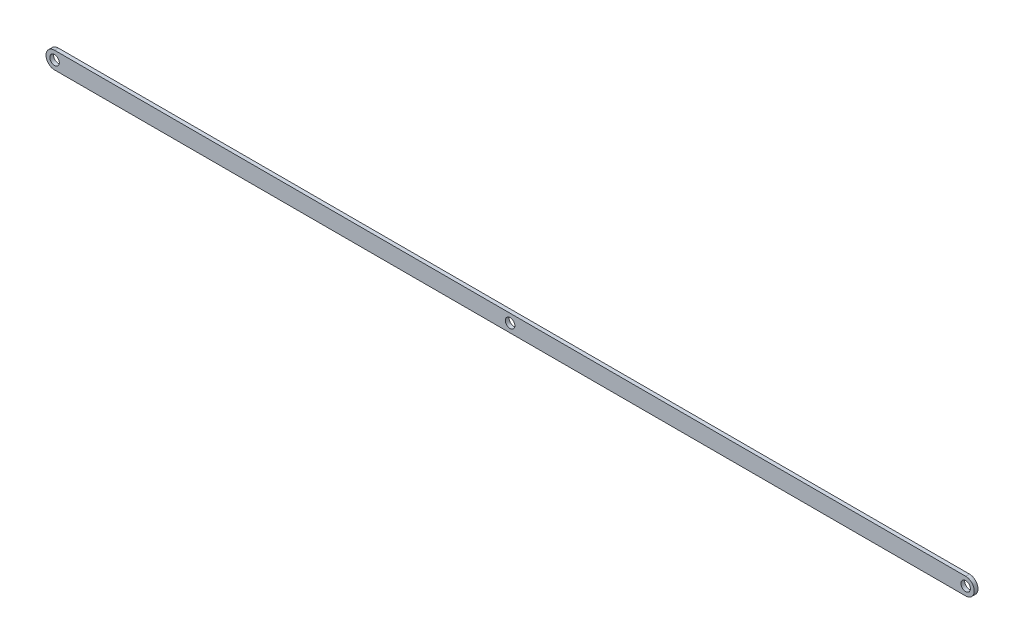
ISO-10303-21;
HEADER;
FILE_DESCRIPTION(('STEP AP214'),'2;1');
FILE_NAME('part.step','',(''),(''),'','','');
FILE_SCHEMA(('AUTOMOTIVE_DESIGN { 1 0 10303 214 1 1 1 1 }'));
ENDSEC;
DATA;
#1=APPLICATION_CONTEXT('core data for automotive mechanical design processes');
#2=APPLICATION_PROTOCOL_DEFINITION('international standard','automotive_design',2000,#1);
#3=PRODUCT_CONTEXT('',#1,'mechanical');
#4=PRODUCT('Part','Part','',(#3));
#5=PRODUCT_RELATED_PRODUCT_CATEGORY('part','',(#4));
#6=PRODUCT_DEFINITION_FORMATION('','',#4);
#7=PRODUCT_DEFINITION_CONTEXT('part definition',#1,'design');
#8=PRODUCT_DEFINITION('design','',#6,#7);
#9=PRODUCT_DEFINITION_SHAPE('','',#8);
#10=(LENGTH_UNIT() NAMED_UNIT(*) SI_UNIT(.MILLI.,.METRE.));
#11=(NAMED_UNIT(*) PLANE_ANGLE_UNIT() SI_UNIT($,.RADIAN.));
#12=(NAMED_UNIT(*) SI_UNIT($,.STERADIAN.) SOLID_ANGLE_UNIT());
#13=UNCERTAINTY_MEASURE_WITH_UNIT(LENGTH_MEASURE(1.E-05),#10,'distance_accuracy_value','');
#14=(GEOMETRIC_REPRESENTATION_CONTEXT(3) GLOBAL_UNCERTAINTY_ASSIGNED_CONTEXT((#13)) GLOBAL_UNIT_ASSIGNED_CONTEXT((#10,
#11,#12)) REPRESENTATION_CONTEXT('',''));
#15=CARTESIAN_POINT('',(0.,0.,0.));
#16=DIRECTION('',(0.,0.,1.));
#17=DIRECTION('',(1.,0.,0.));
#18=AXIS2_PLACEMENT_3D('',#15,#16,#17);
#19=CARTESIAN_POINT('',(-4500.,0.,37.5));
#20=DIRECTION('',(0.,0.,1.));
#21=DIRECTION('',(1.,0.,0.));
#22=AXIS2_PLACEMENT_3D('',#19,#20,#21);
#23=PLANE('',#22);
#24=CARTESIAN_POINT('',(0.,5.51091059616309E-13,37.5));
#25=DIRECTION('',(0.,0.,1.));
#26=DIRECTION('',(1.,0.,0.));
#27=AXIS2_PLACEMENT_3D('',#24,#25,#26);
#28=CIRCLE('',#27,46.875);
#29=CARTESIAN_POINT('',(46.875,5.51091059616309E-13,37.5));
#30=VERTEX_POINT('',#29);
#31=EDGE_CURVE('E117',#30,#30,#28,.T.);
#32=ORIENTED_EDGE('',*,*,#31,.F.);
#33=EDGE_LOOP('',(#32));
#34=FACE_BOUND('',#33,.T.);
#35=CARTESIAN_POINT('',(-4500.,0.,37.5));
#36=DIRECTION('',(0.,0.,1.));
#37=DIRECTION('',(1.,0.,0.));
#38=AXIS2_PLACEMENT_3D('',#35,#36,#37);
#39=CIRCLE('',#38,84.375);
#40=CARTESIAN_POINT('',(-4500.,84.375,37.5));
#41=VERTEX_POINT('',#40);
#42=CARTESIAN_POINT('',(-4500.,-84.375,37.5));
#43=VERTEX_POINT('',#42);
#44=EDGE_CURVE('E87',#41,#43,#39,.T.);
#45=ORIENTED_EDGE('',*,*,#44,.T.);
#46=DIRECTION('',(1.,0.,0.));
#47=VECTOR('',#46,1.);
#48=CARTESIAN_POINT('',(-4500.,-84.375,37.5));
#49=LINE('',#48,#47);
#50=CARTESIAN_POINT('',(4500.,-84.3749999999984,37.5));
#51=VERTEX_POINT('',#50);
#52=EDGE_CURVE('E82',#43,#51,#49,.T.);
#53=ORIENTED_EDGE('',*,*,#52,.T.);
#54=CARTESIAN_POINT('',(4500.,1.65327317884893E-12,37.5));
#55=DIRECTION('',(0.,0.,1.));
#56=DIRECTION('',(1.,0.,0.));
#57=AXIS2_PLACEMENT_3D('',#54,#55,#56);
#58=CIRCLE('',#57,84.375);
#59=CARTESIAN_POINT('',(4500.,84.3750000000017,37.5));
#60=VERTEX_POINT('',#59);
#61=EDGE_CURVE('E85',#51,#60,#58,.T.);
#62=ORIENTED_EDGE('',*,*,#61,.T.);
#63=DIRECTION('',(-1.,0.,0.));
#64=VECTOR('',#63,1.);
#65=CARTESIAN_POINT('',(-4500.,84.375,37.5));
#66=LINE('',#65,#64);
#67=EDGE_CURVE('E52',#60,#41,#66,.T.);
#68=ORIENTED_EDGE('',*,*,#67,.T.);
#69=EDGE_LOOP('',(#45,#53,#62,#68));
#70=FACE_BOUND('',#69,.T.);
#71=CARTESIAN_POINT('',(-4500.,0.,37.5));
#72=DIRECTION('',(0.,0.,1.));
#73=DIRECTION('',(1.,0.,0.));
#74=AXIS2_PLACEMENT_3D('',#71,#72,#73);
#75=CIRCLE('',#74,46.8750000000003);
#76=CARTESIAN_POINT('',(-4453.125,0.,37.5));
#77=VERTEX_POINT('',#76);
#78=EDGE_CURVE('E102',#77,#77,#75,.T.);
#79=ORIENTED_EDGE('',*,*,#78,.F.);
#80=EDGE_LOOP('',(#79));
#81=FACE_BOUND('',#80,.T.);
#82=CARTESIAN_POINT('',(4500.,1.65327317884893E-12,37.5));
#83=DIRECTION('',(0.,0.,1.));
#84=DIRECTION('',(1.,0.,0.));
#85=AXIS2_PLACEMENT_3D('',#82,#83,#84);
#86=CIRCLE('',#85,46.8750000000003);
#87=CARTESIAN_POINT('',(4546.875,1.65327317884893E-12,37.5));
#88=VERTEX_POINT('',#87);
#89=EDGE_CURVE('E123',#88,#88,#86,.T.);
#90=ORIENTED_EDGE('',*,*,#89,.F.);
#91=EDGE_LOOP('',(#90));
#92=FACE_BOUND('',#91,.T.);
#93=ADVANCED_FACE('F35',(#34,#70,#81,#92),#23,.T.);
#94=CARTESIAN_POINT('',(-4500.,0.,0.));
#95=DIRECTION('',(0.,0.,1.));
#96=DIRECTION('',(1.,0.,0.));
#97=AXIS2_PLACEMENT_3D('',#94,#95,#96);
#98=PLANE('',#97);
#99=CARTESIAN_POINT('',(0.,5.51091059616309E-13,0.));
#100=DIRECTION('',(0.,0.,1.));
#101=DIRECTION('',(1.,0.,0.));
#102=AXIS2_PLACEMENT_3D('',#99,#100,#101);
#103=CIRCLE('',#102,46.875);
#104=CARTESIAN_POINT('',(46.875,5.51091059616309E-13,0.));
#105=VERTEX_POINT('',#104);
#106=EDGE_CURVE('E120',#105,#105,#103,.T.);
#107=ORIENTED_EDGE('',*,*,#106,.T.);
#108=EDGE_LOOP('',(#107));
#109=FACE_BOUND('',#108,.T.);
#110=CARTESIAN_POINT('',(-4500.,0.,0.));
#111=DIRECTION('',(0.,0.,1.));
#112=DIRECTION('',(1.,0.,0.));
#113=AXIS2_PLACEMENT_3D('',#110,#111,#112);
#114=CIRCLE('',#113,84.375);
#115=CARTESIAN_POINT('',(-4500.,84.375,0.));
#116=VERTEX_POINT('',#115);
#117=CARTESIAN_POINT('',(-4500.,-84.375,0.));
#118=VERTEX_POINT('',#117);
#119=EDGE_CURVE('E99',#116,#118,#114,.T.);
#120=ORIENTED_EDGE('',*,*,#119,.F.);
#121=DIRECTION('',(-1.,0.,0.));
#122=VECTOR('',#121,1.);
#123=CARTESIAN_POINT('',(-4500.,84.375,0.));
#124=LINE('',#123,#122);
#125=CARTESIAN_POINT('',(4500.,84.3750000000017,0.));
#126=VERTEX_POINT('',#125);
#127=EDGE_CURVE('E75',#126,#116,#124,.T.);
#128=ORIENTED_EDGE('',*,*,#127,.F.);
#129=CARTESIAN_POINT('',(4500.,1.65327317884893E-12,0.));
#130=DIRECTION('',(0.,0.,1.));
#131=DIRECTION('',(1.,0.,0.));
#132=AXIS2_PLACEMENT_3D('',#129,#130,#131);
#133=CIRCLE('',#132,84.375);
#134=CARTESIAN_POINT('',(4500.,-84.3749999999984,0.));
#135=VERTEX_POINT('',#134);
#136=EDGE_CURVE('E69',#135,#126,#133,.T.);
#137=ORIENTED_EDGE('',*,*,#136,.F.);
#138=DIRECTION('',(1.,0.,0.));
#139=VECTOR('',#138,1.);
#140=CARTESIAN_POINT('',(-4500.,-84.375,0.));
#141=LINE('',#140,#139);
#142=EDGE_CURVE('E91',#118,#135,#141,.T.);
#143=ORIENTED_EDGE('',*,*,#142,.F.);
#144=EDGE_LOOP('',(#120,#128,#137,#143));
#145=FACE_BOUND('',#144,.T.);
#146=CARTESIAN_POINT('',(-4500.,0.,0.));
#147=DIRECTION('',(0.,0.,1.));
#148=DIRECTION('',(1.,0.,0.));
#149=AXIS2_PLACEMENT_3D('',#146,#147,#148);
#150=CIRCLE('',#149,46.8750000000003);
#151=CARTESIAN_POINT('',(-4453.125,0.,0.));
#152=VERTEX_POINT('',#151);
#153=EDGE_CURVE('E114',#152,#152,#150,.T.);
#154=ORIENTED_EDGE('',*,*,#153,.T.);
#155=EDGE_LOOP('',(#154));
#156=FACE_BOUND('',#155,.T.);
#157=CARTESIAN_POINT('',(4500.,1.65327317884893E-12,0.));
#158=DIRECTION('',(0.,0.,1.));
#159=DIRECTION('',(1.,0.,0.));
#160=AXIS2_PLACEMENT_3D('',#157,#158,#159);
#161=CIRCLE('',#160,46.8750000000003);
#162=CARTESIAN_POINT('',(4546.875,1.65327317884893E-12,0.));
#163=VERTEX_POINT('',#162);
#164=EDGE_CURVE('E126',#163,#163,#161,.T.);
#165=ORIENTED_EDGE('',*,*,#164,.T.);
#166=EDGE_LOOP('',(#165));
#167=FACE_BOUND('',#166,.T.);
#168=ADVANCED_FACE('F110',(#109,#145,#156,#167),#98,.F.);
#169=CARTESIAN_POINT('',(-4500.,0.,37.5));
#170=DIRECTION('',(0.,0.,-1.));
#171=DIRECTION('',(-1.,0.,0.));
#172=AXIS2_PLACEMENT_3D('',#169,#170,#171);
#173=CYLINDRICAL_SURFACE('',#172,84.375);
#174=ORIENTED_EDGE('',*,*,#119,.T.);
#175=DIRECTION('',(0.,0.,-1.));
#176=VECTOR('',#175,1.);
#177=CARTESIAN_POINT('',(-4500.,-84.375,37.5));
#178=LINE('',#177,#176);
#179=EDGE_CURVE('E11',#43,#118,#178,.T.);
#180=ORIENTED_EDGE('',*,*,#179,.F.);
#181=ORIENTED_EDGE('',*,*,#44,.F.);
#182=DIRECTION('',(0.,0.,-1.));
#183=VECTOR('',#182,1.);
#184=CARTESIAN_POINT('',(-4500.,84.375,37.5));
#185=LINE('',#184,#183);
#186=EDGE_CURVE('E95',#41,#116,#185,.T.);
#187=ORIENTED_EDGE('',*,*,#186,.T.);
#188=EDGE_LOOP('',(#174,#180,#181,#187));
#189=FACE_BOUND('',#188,.T.);
#190=ADVANCED_FACE('F37',(#189),#173,.T.);
#191=CARTESIAN_POINT('',(-4500.,-84.375,37.5));
#192=DIRECTION('',(0.,1.,0.));
#193=DIRECTION('',(-1.,0.,0.));
#194=AXIS2_PLACEMENT_3D('',#191,#192,#193);
#195=PLANE('',#194);
#196=ORIENTED_EDGE('',*,*,#142,.T.);
#197=DIRECTION('',(0.,0.,-1.));
#198=VECTOR('',#197,1.);
#199=CARTESIAN_POINT('',(4500.,-84.3749999999984,37.5));
#200=LINE('',#199,#198);
#201=EDGE_CURVE('E44',#51,#135,#200,.T.);
#202=ORIENTED_EDGE('',*,*,#201,.F.);
#203=ORIENTED_EDGE('',*,*,#52,.F.);
#204=ORIENTED_EDGE('',*,*,#179,.T.);
#205=EDGE_LOOP('',(#196,#202,#203,#204));
#206=FACE_BOUND('',#205,.T.);
#207=ADVANCED_FACE('F90',(#206),#195,.F.);
#208=CARTESIAN_POINT('',(4500.,1.65327317884893E-12,37.5));
#209=DIRECTION('',(0.,0.,-1.));
#210=DIRECTION('',(-1.,0.,0.));
#211=AXIS2_PLACEMENT_3D('',#208,#209,#210);
#212=CYLINDRICAL_SURFACE('',#211,84.375);
#213=ORIENTED_EDGE('',*,*,#136,.T.);
#214=DIRECTION('',(0.,0.,-1.));
#215=VECTOR('',#214,1.);
#216=CARTESIAN_POINT('',(4500.,84.3750000000017,37.5));
#217=LINE('',#216,#215);
#218=EDGE_CURVE('E92',#60,#126,#217,.T.);
#219=ORIENTED_EDGE('',*,*,#218,.F.);
#220=ORIENTED_EDGE('',*,*,#61,.F.);
#221=ORIENTED_EDGE('',*,*,#201,.T.);
#222=EDGE_LOOP('',(#213,#219,#220,#221));
#223=FACE_BOUND('',#222,.T.);
#224=ADVANCED_FACE('F93',(#223),#212,.T.);
#225=CARTESIAN_POINT('',(-4500.,84.375,37.5));
#226=DIRECTION('',(0.,-1.,0.));
#227=DIRECTION('',(1.,0.,0.));
#228=AXIS2_PLACEMENT_3D('',#225,#226,#227);
#229=PLANE('',#228);
#230=ORIENTED_EDGE('',*,*,#127,.T.);
#231=ORIENTED_EDGE('',*,*,#186,.F.);
#232=ORIENTED_EDGE('',*,*,#67,.F.);
#233=ORIENTED_EDGE('',*,*,#218,.T.);
#234=EDGE_LOOP('',(#230,#231,#232,#233));
#235=FACE_BOUND('',#234,.T.);
#236=ADVANCED_FACE('F107',(#235),#229,.F.);
#237=CARTESIAN_POINT('',(-4500.,0.,37.5));
#238=DIRECTION('',(0.,0.,-1.));
#239=DIRECTION('',(-1.,0.,0.));
#240=AXIS2_PLACEMENT_3D('',#237,#238,#239);
#241=CYLINDRICAL_SURFACE('',#240,46.8750000000003);
#242=ORIENTED_EDGE('',*,*,#78,.T.);
#243=EDGE_LOOP('',(#242));
#244=FACE_BOUND('',#243,.T.);
#245=ORIENTED_EDGE('',*,*,#153,.F.);
#246=EDGE_LOOP('',(#245));
#247=FACE_BOUND('',#246,.T.);
#248=ADVANCED_FACE('F145',(#244,#247),#241,.F.);
#249=CARTESIAN_POINT('',(0.,5.51091059616309E-13,37.5));
#250=DIRECTION('',(0.,0.,-1.));
#251=DIRECTION('',(-1.,0.,0.));
#252=AXIS2_PLACEMENT_3D('',#249,#250,#251);
#253=CYLINDRICAL_SURFACE('',#252,46.875);
#254=ORIENTED_EDGE('',*,*,#31,.T.);
#255=EDGE_LOOP('',(#254));
#256=FACE_BOUND('',#255,.T.);
#257=ORIENTED_EDGE('',*,*,#106,.F.);
#258=EDGE_LOOP('',(#257));
#259=FACE_BOUND('',#258,.T.);
#260=ADVANCED_FACE('F191',(#256,#259),#253,.F.);
#261=CARTESIAN_POINT('',(4500.,1.65327317884893E-12,37.5));
#262=DIRECTION('',(0.,0.,-1.));
#263=DIRECTION('',(-1.,0.,0.));
#264=AXIS2_PLACEMENT_3D('',#261,#262,#263);
#265=CYLINDRICAL_SURFACE('',#264,46.8750000000003);
#266=ORIENTED_EDGE('',*,*,#89,.T.);
#267=EDGE_LOOP('',(#266));
#268=FACE_BOUND('',#267,.T.);
#269=ORIENTED_EDGE('',*,*,#164,.F.);
#270=EDGE_LOOP('',(#269));
#271=FACE_BOUND('',#270,.T.);
#272=ADVANCED_FACE('F132',(#268,#271),#265,.F.);
#273=CLOSED_SHELL('',(#93,#168,#190,#207,#224,#236,#248,#260,#272));
#274=MANIFOLD_SOLID_BREP('B2',#273);
#275=ADVANCED_BREP_SHAPE_REPRESENTATION('',(#18,#274),#14);
#276=SHAPE_DEFINITION_REPRESENTATION(#9,#275);
ENDSEC;
END-ISO-10303-21;
